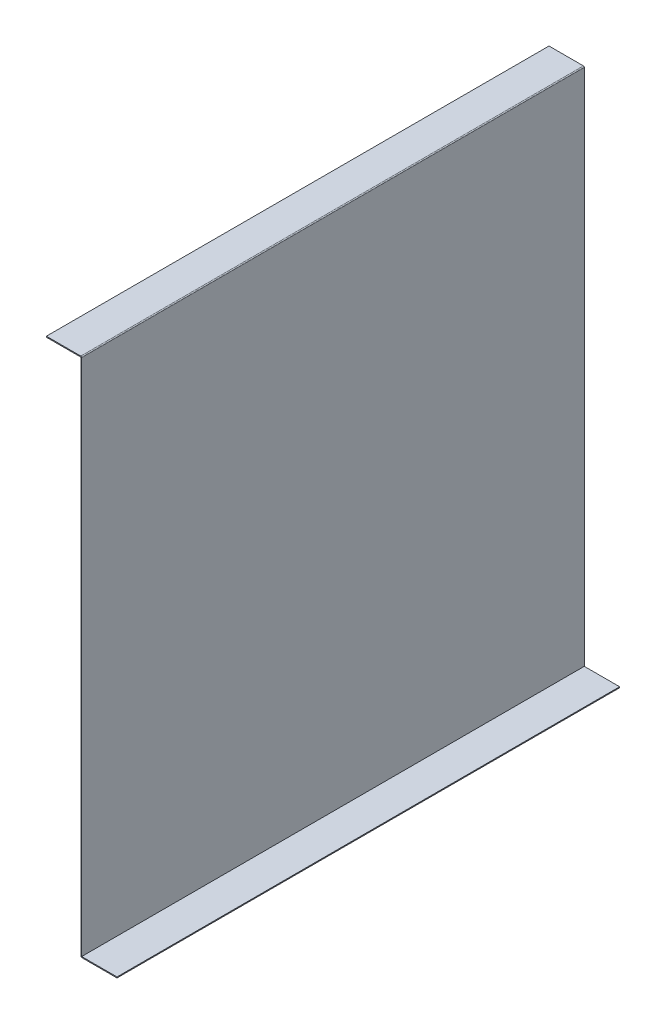
ISO-10303-21;
HEADER;
FILE_DESCRIPTION(('STEP AP214'),'2;1');
FILE_NAME('part.step','',(''),(''),'','','');
FILE_SCHEMA(('AUTOMOTIVE_DESIGN { 1 0 10303 214 1 1 1 1 }'));
ENDSEC;
DATA;
#1=APPLICATION_CONTEXT('core data for automotive mechanical design processes');
#2=APPLICATION_PROTOCOL_DEFINITION('international standard','automotive_design',2000,#1);
#3=PRODUCT_CONTEXT('',#1,'mechanical');
#4=PRODUCT('Part','Part','',(#3));
#5=PRODUCT_RELATED_PRODUCT_CATEGORY('part','',(#4));
#6=PRODUCT_DEFINITION_FORMATION('','',#4);
#7=PRODUCT_DEFINITION_CONTEXT('part definition',#1,'design');
#8=PRODUCT_DEFINITION('design','',#6,#7);
#9=PRODUCT_DEFINITION_SHAPE('','',#8);
#10=(LENGTH_UNIT() NAMED_UNIT(*) SI_UNIT(.MILLI.,.METRE.));
#11=(NAMED_UNIT(*) PLANE_ANGLE_UNIT() SI_UNIT($,.RADIAN.));
#12=(NAMED_UNIT(*) SI_UNIT($,.STERADIAN.) SOLID_ANGLE_UNIT());
#13=UNCERTAINTY_MEASURE_WITH_UNIT(LENGTH_MEASURE(1.E-05),#10,'distance_accuracy_value','');
#14=(GEOMETRIC_REPRESENTATION_CONTEXT(3) GLOBAL_UNCERTAINTY_ASSIGNED_CONTEXT((#13)) GLOBAL_UNIT_ASSIGNED_CONTEXT((#10,
#11,#12)) REPRESENTATION_CONTEXT('',''));
#15=CARTESIAN_POINT('',(0.,0.,0.));
#16=DIRECTION('',(0.,0.,1.));
#17=DIRECTION('',(1.,0.,0.));
#18=AXIS2_PLACEMENT_3D('',#15,#16,#17);
#19=CARTESIAN_POINT('',(-44.144869739479,440.61,213.5));
#20=DIRECTION('',(0.,0.,1.));
#21=DIRECTION('',(1.,0.,0.));
#22=AXIS2_PLACEMENT_3D('',#19,#20,#21);
#23=PLANE('',#22);
#24=DIRECTION('',(1.,0.,0.));
#25=VECTOR('',#24,1.);
#26=CARTESIAN_POINT('',(-44.144869739479,440.61,213.5));
#27=LINE('',#26,#25);
#28=CARTESIAN_POINT('',(-44.144869739479,440.61,213.5));
#29=VERTEX_POINT('',#28);
#30=CARTESIAN_POINT('',(-43.344869739479,440.61,213.5));
#31=VERTEX_POINT('',#30);
#32=EDGE_CURVE('E11',#29,#31,#27,.T.);
#33=ORIENTED_EDGE('',*,*,#32,.F.);
#34=DIRECTION('',(0.,1.,0.));
#35=VECTOR('',#34,1.);
#36=CARTESIAN_POINT('',(-44.144869739479,441.41,213.5));
#37=LINE('',#36,#35);
#38=CARTESIAN_POINT('',(-44.144869739479,0.,213.5));
#39=VERTEX_POINT('',#38);
#40=EDGE_CURVE('E159',#29,#39,#37,.F.);
#41=ORIENTED_EDGE('',*,*,#40,.T.);
#42=DIRECTION('',(-1.,0.,0.));
#43=VECTOR('',#42,1.);
#44=CARTESIAN_POINT('',(-43.344869739479,0.,213.5));
#45=LINE('',#44,#43);
#46=CARTESIAN_POINT('',(-43.344869739479,0.,213.5));
#47=VERTEX_POINT('',#46);
#48=EDGE_CURVE('E51',#47,#39,#45,.T.);
#49=ORIENTED_EDGE('',*,*,#48,.F.);
#50=DIRECTION('',(0.,-1.,0.));
#51=VECTOR('',#50,1.);
#52=CARTESIAN_POINT('',(-43.344869739479,441.41,213.5));
#53=LINE('',#52,#51);
#54=EDGE_CURVE('E142',#31,#47,#53,.T.);
#55=ORIENTED_EDGE('',*,*,#54,.F.);
#56=EDGE_LOOP('',(#33,#41,#49,#55));
#57=FACE_BOUND('',#56,.T.);
#58=ADVANCED_FACE('F37',(#57),#23,.T.);
#59=CARTESIAN_POINT('',(-44.144869739479,440.61,213.5));
#60=DIRECTION('',(0.,0.,1.));
#61=DIRECTION('',(1.,0.,0.));
#62=AXIS2_PLACEMENT_3D('',#59,#60,#61);
#63=PLANE('',#62);
#64=DIRECTION('',(0.,1.,0.));
#65=VECTOR('',#64,1.);
#66=CARTESIAN_POINT('',(-44.144869739479,440.61,213.5));
#67=LINE('',#66,#65);
#68=CARTESIAN_POINT('',(-44.144869739479,441.41,213.5));
#69=VERTEX_POINT('',#68);
#70=EDGE_CURVE('E44',#29,#69,#67,.T.);
#71=ORIENTED_EDGE('',*,*,#70,.F.);
#72=ORIENTED_EDGE('',*,*,#32,.T.);
#73=CARTESIAN_POINT('',(-44.144869739479,440.61,213.5));
#74=DIRECTION('',(0.,0.,1.));
#75=DIRECTION('',(1.,0.,0.));
#76=AXIS2_PLACEMENT_3D('',#73,#74,#75);
#77=CIRCLE('',#76,0.8);
#78=EDGE_CURVE('E147',#69,#31,#77,.F.);
#79=ORIENTED_EDGE('',*,*,#78,.F.);
#80=EDGE_LOOP('',(#71,#72,#79));
#81=FACE_BOUND('',#80,.T.);
#82=ADVANCED_FACE('F231',(#81),#63,.T.);
#83=CARTESIAN_POINT('',(-44.144869739479,440.61,-213.5));
#84=DIRECTION('',(0.,0.,-1.));
#85=DIRECTION('',(-1.,0.,0.));
#86=AXIS2_PLACEMENT_3D('',#83,#84,#85);
#87=PLANE('',#86);
#88=DIRECTION('',(0.,1.,0.));
#89=VECTOR('',#88,1.);
#90=CARTESIAN_POINT('',(-44.144869739479,440.61,-213.5));
#91=LINE('',#90,#89);
#92=CARTESIAN_POINT('',(-44.144869739479,440.61,-213.5));
#93=VERTEX_POINT('',#92);
#94=CARTESIAN_POINT('',(-44.144869739479,441.41,-213.5));
#95=VERTEX_POINT('',#94);
#96=EDGE_CURVE('E215',#93,#95,#91,.T.);
#97=ORIENTED_EDGE('',*,*,#96,.F.);
#98=DIRECTION('',(1.,0.,0.));
#99=VECTOR('',#98,1.);
#100=CARTESIAN_POINT('',(-73.344869739479,440.61,-213.5));
#101=LINE('',#100,#99);
#102=CARTESIAN_POINT('',(-73.344869739479,440.61,-213.5));
#103=VERTEX_POINT('',#102);
#104=EDGE_CURVE('E180',#103,#93,#101,.T.);
#105=ORIENTED_EDGE('',*,*,#104,.F.);
#106=DIRECTION('',(0.,1.,0.));
#107=VECTOR('',#106,1.);
#108=CARTESIAN_POINT('',(-73.344869739479,440.61,-213.5));
#109=LINE('',#108,#107);
#110=CARTESIAN_POINT('',(-73.344869739479,441.41,-213.5));
#111=VERTEX_POINT('',#110);
#112=EDGE_CURVE('E177',#103,#111,#109,.T.);
#113=ORIENTED_EDGE('',*,*,#112,.T.);
#114=DIRECTION('',(1.,0.,0.));
#115=VECTOR('',#114,1.);
#116=CARTESIAN_POINT('',(-73.344869739479,441.41,-213.5));
#117=LINE('',#116,#115);
#118=EDGE_CURVE('E174',#111,#95,#117,.T.);
#119=ORIENTED_EDGE('',*,*,#118,.T.);
#120=EDGE_LOOP('',(#97,#105,#113,#119));
#121=FACE_BOUND('',#120,.T.);
#122=ADVANCED_FACE('F262',(#121),#87,.T.);
#123=CARTESIAN_POINT('',(-44.144869739479,440.61,-213.5));
#124=DIRECTION('',(0.,0.,-1.));
#125=DIRECTION('',(-1.,0.,0.));
#126=AXIS2_PLACEMENT_3D('',#123,#124,#125);
#127=PLANE('',#126);
#128=DIRECTION('',(1.,0.,0.));
#129=VECTOR('',#128,1.);
#130=CARTESIAN_POINT('',(-44.144869739479,440.61,-213.5));
#131=LINE('',#130,#129);
#132=CARTESIAN_POINT('',(-43.344869739479,440.61,-213.5));
#133=VERTEX_POINT('',#132);
#134=EDGE_CURVE('E213',#93,#133,#131,.T.);
#135=ORIENTED_EDGE('',*,*,#134,.F.);
#136=ORIENTED_EDGE('',*,*,#96,.T.);
#137=CARTESIAN_POINT('',(-44.144869739479,440.61,-213.5));
#138=DIRECTION('',(0.,0.,1.));
#139=DIRECTION('',(1.,0.,0.));
#140=AXIS2_PLACEMENT_3D('',#137,#138,#139);
#141=CIRCLE('',#140,0.8);
#142=EDGE_CURVE('E171',#95,#133,#141,.F.);
#143=ORIENTED_EDGE('',*,*,#142,.T.);
#144=EDGE_LOOP('',(#135,#136,#143));
#145=FACE_BOUND('',#144,.T.);
#146=ADVANCED_FACE('F260',(#145),#127,.T.);
#147=CARTESIAN_POINT('',(-43.344869739479,0.,-213.5));
#148=DIRECTION('',(0.,0.,-1.));
#149=DIRECTION('',(-1.,0.,0.));
#150=AXIS2_PLACEMENT_3D('',#147,#148,#149);
#151=PLANE('',#150);
#152=DIRECTION('',(0.,-1.,0.));
#153=VECTOR('',#152,1.);
#154=CARTESIAN_POINT('',(-43.344869739479,0.,-213.5));
#155=LINE('',#154,#153);
#156=CARTESIAN_POINT('',(-43.344869739479,0.,-213.5));
#157=VERTEX_POINT('',#156);
#158=CARTESIAN_POINT('',(-43.344869739479,-0.8,-213.5));
#159=VERTEX_POINT('',#158);
#160=EDGE_CURVE('E211',#157,#159,#155,.T.);
#161=ORIENTED_EDGE('',*,*,#160,.F.);
#162=DIRECTION('',(1.,0.,0.));
#163=VECTOR('',#162,1.);
#164=CARTESIAN_POINT('',(-43.344869739479,0.,-213.5));
#165=LINE('',#164,#163);
#166=CARTESIAN_POINT('',(-13.3448697394789,0.,-213.5));
#167=VERTEX_POINT('',#166);
#168=EDGE_CURVE('E166',#157,#167,#165,.T.);
#169=ORIENTED_EDGE('',*,*,#168,.T.);
#170=DIRECTION('',(0.,-1.,0.));
#171=VECTOR('',#170,1.);
#172=CARTESIAN_POINT('',(-13.3448697394789,0.,-213.5));
#173=LINE('',#172,#171);
#174=CARTESIAN_POINT('',(-13.3448697394789,-0.8,-213.5));
#175=VERTEX_POINT('',#174);
#176=EDGE_CURVE('E164',#167,#175,#173,.T.);
#177=ORIENTED_EDGE('',*,*,#176,.T.);
#178=DIRECTION('',(1.,0.,0.));
#179=VECTOR('',#178,1.);
#180=CARTESIAN_POINT('',(-43.344869739479,-0.8,-213.5));
#181=LINE('',#180,#179);
#182=EDGE_CURVE('E132',#159,#175,#181,.T.);
#183=ORIENTED_EDGE('',*,*,#182,.F.);
#184=EDGE_LOOP('',(#161,#169,#177,#183));
#185=FACE_BOUND('',#184,.T.);
#186=ADVANCED_FACE('F269',(#185),#151,.T.);
#187=CARTESIAN_POINT('',(-43.344869739479,0.,-213.5));
#188=DIRECTION('',(0.,0.,-1.));
#189=DIRECTION('',(-1.,0.,0.));
#190=AXIS2_PLACEMENT_3D('',#187,#188,#189);
#191=PLANE('',#190);
#192=DIRECTION('',(-1.,0.,0.));
#193=VECTOR('',#192,1.);
#194=CARTESIAN_POINT('',(-43.344869739479,0.,-213.5));
#195=LINE('',#194,#193);
#196=CARTESIAN_POINT('',(-44.144869739479,0.,-213.5));
#197=VERTEX_POINT('',#196);
#198=EDGE_CURVE('E59',#157,#197,#195,.T.);
#199=ORIENTED_EDGE('',*,*,#198,.F.);
#200=ORIENTED_EDGE('',*,*,#160,.T.);
#201=CARTESIAN_POINT('',(-43.344869739479,0.,-213.5));
#202=DIRECTION('',(0.,0.,1.));
#203=DIRECTION('',(1.,0.,0.));
#204=AXIS2_PLACEMENT_3D('',#201,#202,#203);
#205=CIRCLE('',#204,0.8);
#206=EDGE_CURVE('E202',#159,#197,#205,.F.);
#207=ORIENTED_EDGE('',*,*,#206,.T.);
#208=EDGE_LOOP('',(#199,#200,#207));
#209=FACE_BOUND('',#208,.T.);
#210=ADVANCED_FACE('F300',(#209),#191,.T.);
#211=CARTESIAN_POINT('',(-43.344869739479,0.,213.5));
#212=DIRECTION('',(0.,0.,1.));
#213=DIRECTION('',(1.,0.,0.));
#214=AXIS2_PLACEMENT_3D('',#211,#212,#213);
#215=PLANE('',#214);
#216=DIRECTION('',(1.,0.,0.));
#217=VECTOR('',#216,1.);
#218=CARTESIAN_POINT('',(-73.344869739479,440.61,213.5));
#219=LINE('',#218,#217);
#220=CARTESIAN_POINT('',(-73.344869739479,440.61,213.5));
#221=VERTEX_POINT('',#220);
#222=EDGE_CURVE('E156',#221,#29,#219,.T.);
#223=ORIENTED_EDGE('',*,*,#222,.T.);
#224=ORIENTED_EDGE('',*,*,#70,.T.);
#225=DIRECTION('',(1.,0.,0.));
#226=VECTOR('',#225,1.);
#227=CARTESIAN_POINT('',(-73.344869739479,441.41,213.5));
#228=LINE('',#227,#226);
#229=CARTESIAN_POINT('',(-73.344869739479,441.41,213.5));
#230=VERTEX_POINT('',#229);
#231=EDGE_CURVE('E150',#230,#69,#228,.T.);
#232=ORIENTED_EDGE('',*,*,#231,.F.);
#233=DIRECTION('',(0.,1.,0.));
#234=VECTOR('',#233,1.);
#235=CARTESIAN_POINT('',(-73.344869739479,440.61,213.5));
#236=LINE('',#235,#234);
#237=EDGE_CURVE('E153',#221,#230,#236,.T.);
#238=ORIENTED_EDGE('',*,*,#237,.F.);
#239=EDGE_LOOP('',(#223,#224,#232,#238));
#240=FACE_BOUND('',#239,.T.);
#241=ADVANCED_FACE('F220',(#240),#215,.T.);
#242=CARTESIAN_POINT('',(-43.344869739479,0.,213.5));
#243=DIRECTION('',(0.,0.,1.));
#244=DIRECTION('',(1.,0.,0.));
#245=AXIS2_PLACEMENT_3D('',#242,#243,#244);
#246=PLANE('',#245);
#247=DIRECTION('',(0.,-1.,0.));
#248=VECTOR('',#247,1.);
#249=CARTESIAN_POINT('',(-43.344869739479,0.,213.5));
#250=LINE('',#249,#248);
#251=CARTESIAN_POINT('',(-43.344869739479,-0.8,213.5));
#252=VERTEX_POINT('',#251);
#253=EDGE_CURVE('E122',#47,#252,#250,.T.);
#254=ORIENTED_EDGE('',*,*,#253,.F.);
#255=ORIENTED_EDGE('',*,*,#48,.T.);
#256=CARTESIAN_POINT('',(-43.344869739479,0.,213.5));
#257=DIRECTION('',(0.,0.,1.));
#258=DIRECTION('',(1.,0.,0.));
#259=AXIS2_PLACEMENT_3D('',#256,#257,#258);
#260=CIRCLE('',#259,0.8);
#261=EDGE_CURVE('E206',#39,#252,#260,.T.);
#262=ORIENTED_EDGE('',*,*,#261,.T.);
#263=EDGE_LOOP('',(#254,#255,#262));
#264=FACE_BOUND('',#263,.T.);
#265=ADVANCED_FACE('F250',(#264),#246,.T.);
#266=CARTESIAN_POINT('',(-43.344869739479,-0.8,213.5));
#267=DIRECTION('',(0.,1.,0.));
#268=DIRECTION('',(0.,0.,1.));
#269=AXIS2_PLACEMENT_3D('',#266,#267,#268);
#270=PLANE('',#269);
#271=DIRECTION('',(1.,0.,0.));
#272=VECTOR('',#271,1.);
#273=CARTESIAN_POINT('',(-43.344869739479,-0.8,213.5));
#274=LINE('',#273,#272);
#275=CARTESIAN_POINT('',(-13.3448697394789,-0.8,213.5));
#276=VERTEX_POINT('',#275);
#277=EDGE_CURVE('E115',#252,#276,#274,.T.);
#278=ORIENTED_EDGE('',*,*,#277,.F.);
#279=DIRECTION('',(0.,0.,-1.));
#280=VECTOR('',#279,1.);
#281=CARTESIAN_POINT('',(-43.344869739479,-0.8,213.5));
#282=LINE('',#281,#280);
#283=EDGE_CURVE('E136',#252,#159,#282,.T.);
#284=ORIENTED_EDGE('',*,*,#283,.T.);
#285=ORIENTED_EDGE('',*,*,#182,.T.);
#286=DIRECTION('',(0.,0.,-1.));
#287=VECTOR('',#286,1.);
#288=CARTESIAN_POINT('',(-13.3448697394789,-0.8,213.5));
#289=LINE('',#288,#287);
#290=EDGE_CURVE('E129',#276,#175,#289,.T.);
#291=ORIENTED_EDGE('',*,*,#290,.F.);
#292=EDGE_LOOP('',(#278,#284,#285,#291));
#293=FACE_BOUND('',#292,.T.);
#294=ADVANCED_FACE('F130',(#293),#270,.F.);
#295=CARTESIAN_POINT('',(-13.3448697394789,0.,213.5));
#296=DIRECTION('',(1.,0.,0.));
#297=DIRECTION('',(0.,0.,-1.));
#298=AXIS2_PLACEMENT_3D('',#295,#296,#297);
#299=PLANE('',#298);
#300=ORIENTED_EDGE('',*,*,#176,.F.);
#301=DIRECTION('',(0.,0.,-1.));
#302=VECTOR('',#301,1.);
#303=CARTESIAN_POINT('',(-13.3448697394789,0.,213.5));
#304=LINE('',#303,#302);
#305=CARTESIAN_POINT('',(-13.3448697394789,0.,213.5));
#306=VERTEX_POINT('',#305);
#307=EDGE_CURVE('E137',#306,#167,#304,.T.);
#308=ORIENTED_EDGE('',*,*,#307,.F.);
#309=DIRECTION('',(0.,-1.,0.));
#310=VECTOR('',#309,1.);
#311=CARTESIAN_POINT('',(-13.3448697394789,0.,213.5));
#312=LINE('',#311,#310);
#313=EDGE_CURVE('E120',#306,#276,#312,.T.);
#314=ORIENTED_EDGE('',*,*,#313,.T.);
#315=ORIENTED_EDGE('',*,*,#290,.T.);
#316=EDGE_LOOP('',(#300,#308,#314,#315));
#317=FACE_BOUND('',#316,.T.);
#318=ADVANCED_FACE('F139',(#317),#299,.T.);
#319=CARTESIAN_POINT('',(-43.344869739479,0.,213.5));
#320=DIRECTION('',(0.,1.,0.));
#321=DIRECTION('',(0.,0.,1.));
#322=AXIS2_PLACEMENT_3D('',#319,#320,#321);
#323=PLANE('',#322);
#324=ORIENTED_EDGE('',*,*,#168,.F.);
#325=DIRECTION('',(0.,0.,-1.));
#326=VECTOR('',#325,1.);
#327=CARTESIAN_POINT('',(-43.344869739479,0.,213.5));
#328=LINE('',#327,#326);
#329=EDGE_CURVE('E197',#47,#157,#328,.T.);
#330=ORIENTED_EDGE('',*,*,#329,.F.);
#331=DIRECTION('',(1.,0.,0.));
#332=VECTOR('',#331,1.);
#333=CARTESIAN_POINT('',(-43.344869739479,0.,213.5));
#334=LINE('',#333,#332);
#335=EDGE_CURVE('E140',#47,#306,#334,.T.);
#336=ORIENTED_EDGE('',*,*,#335,.T.);
#337=ORIENTED_EDGE('',*,*,#307,.T.);
#338=EDGE_LOOP('',(#324,#330,#336,#337));
#339=FACE_BOUND('',#338,.T.);
#340=ADVANCED_FACE('F254',(#339),#323,.T.);
#341=CARTESIAN_POINT('',(-43.344869739479,441.41,213.5));
#342=DIRECTION('',(1.,0.,0.));
#343=DIRECTION('',(0.,0.,-1.));
#344=AXIS2_PLACEMENT_3D('',#341,#342,#343);
#345=PLANE('',#344);
#346=DIRECTION('',(0.,-1.,0.));
#347=VECTOR('',#346,1.);
#348=CARTESIAN_POINT('',(-43.344869739479,441.41,-213.5));
#349=LINE('',#348,#347);
#350=EDGE_CURVE('E169',#133,#157,#349,.T.);
#351=ORIENTED_EDGE('',*,*,#350,.F.);
#352=DIRECTION('',(0.,0.,-1.));
#353=VECTOR('',#352,1.);
#354=CARTESIAN_POINT('',(-43.344869739479,440.61,213.5));
#355=LINE('',#354,#353);
#356=EDGE_CURVE('E194',#31,#133,#355,.T.);
#357=ORIENTED_EDGE('',*,*,#356,.F.);
#358=ORIENTED_EDGE('',*,*,#54,.T.);
#359=ORIENTED_EDGE('',*,*,#329,.T.);
#360=EDGE_LOOP('',(#351,#357,#358,#359));
#361=FACE_BOUND('',#360,.T.);
#362=ADVANCED_FACE('F257',(#361),#345,.T.);
#363=CARTESIAN_POINT('',(-44.144869739479,440.61,213.5));
#364=DIRECTION('',(0.,0.,-1.));
#365=DIRECTION('',(-1.,0.,0.));
#366=AXIS2_PLACEMENT_3D('',#363,#364,#365);
#367=CYLINDRICAL_SURFACE('',#366,0.8);
#368=ORIENTED_EDGE('',*,*,#142,.F.);
#369=DIRECTION('',(0.,0.,-1.));
#370=VECTOR('',#369,1.);
#371=CARTESIAN_POINT('',(-44.144869739479,441.41,213.5));
#372=LINE('',#371,#370);
#373=EDGE_CURVE('E191',#69,#95,#372,.T.);
#374=ORIENTED_EDGE('',*,*,#373,.F.);
#375=ORIENTED_EDGE('',*,*,#78,.T.);
#376=ORIENTED_EDGE('',*,*,#356,.T.);
#377=EDGE_LOOP('',(#368,#374,#375,#376));
#378=FACE_BOUND('',#377,.T.);
#379=ADVANCED_FACE('F228',(#378),#367,.T.);
#380=CARTESIAN_POINT('',(-73.344869739479,441.41,213.5));
#381=DIRECTION('',(0.,1.,0.));
#382=DIRECTION('',(0.,0.,1.));
#383=AXIS2_PLACEMENT_3D('',#380,#381,#382);
#384=PLANE('',#383);
#385=ORIENTED_EDGE('',*,*,#118,.F.);
#386=DIRECTION('',(0.,0.,-1.));
#387=VECTOR('',#386,1.);
#388=CARTESIAN_POINT('',(-73.344869739479,441.41,213.5));
#389=LINE('',#388,#387);
#390=EDGE_CURVE('E189',#230,#111,#389,.T.);
#391=ORIENTED_EDGE('',*,*,#390,.F.);
#392=ORIENTED_EDGE('',*,*,#231,.T.);
#393=ORIENTED_EDGE('',*,*,#373,.T.);
#394=EDGE_LOOP('',(#385,#391,#392,#393));
#395=FACE_BOUND('',#394,.T.);
#396=ADVANCED_FACE('F233',(#395),#384,.T.);
#397=CARTESIAN_POINT('',(-73.344869739479,440.61,213.5));
#398=DIRECTION('',(-1.,0.,0.));
#399=DIRECTION('',(0.,0.,1.));
#400=AXIS2_PLACEMENT_3D('',#397,#398,#399);
#401=PLANE('',#400);
#402=ORIENTED_EDGE('',*,*,#112,.F.);
#403=DIRECTION('',(0.,0.,-1.));
#404=VECTOR('',#403,1.);
#405=CARTESIAN_POINT('',(-73.344869739479,440.61,213.5));
#406=LINE('',#405,#404);
#407=EDGE_CURVE('E187',#221,#103,#406,.T.);
#408=ORIENTED_EDGE('',*,*,#407,.F.);
#409=ORIENTED_EDGE('',*,*,#237,.T.);
#410=ORIENTED_EDGE('',*,*,#390,.T.);
#411=EDGE_LOOP('',(#402,#408,#409,#410));
#412=FACE_BOUND('',#411,.T.);
#413=ADVANCED_FACE('F236',(#412),#401,.T.);
#414=CARTESIAN_POINT('',(-73.344869739479,440.61,213.5));
#415=DIRECTION('',(0.,1.,0.));
#416=DIRECTION('',(0.,0.,1.));
#417=AXIS2_PLACEMENT_3D('',#414,#415,#416);
#418=PLANE('',#417);
#419=ORIENTED_EDGE('',*,*,#104,.T.);
#420=DIRECTION('',(0.,0.,-1.));
#421=VECTOR('',#420,1.);
#422=CARTESIAN_POINT('',(-44.144869739479,440.61,213.5));
#423=LINE('',#422,#421);
#424=EDGE_CURVE('E162',#29,#93,#423,.T.);
#425=ORIENTED_EDGE('',*,*,#424,.F.);
#426=ORIENTED_EDGE('',*,*,#222,.F.);
#427=ORIENTED_EDGE('',*,*,#407,.T.);
#428=EDGE_LOOP('',(#419,#425,#426,#427));
#429=FACE_BOUND('',#428,.T.);
#430=ADVANCED_FACE('F239',(#429),#418,.F.);
#431=CARTESIAN_POINT('',(-44.144869739479,441.41,213.5));
#432=DIRECTION('',(1.,0.,0.));
#433=DIRECTION('',(0.,0.,-1.));
#434=AXIS2_PLACEMENT_3D('',#431,#432,#433);
#435=PLANE('',#434);
#436=DIRECTION('',(0.,1.,0.));
#437=VECTOR('',#436,1.);
#438=CARTESIAN_POINT('',(-44.144869739479,441.41,-213.5));
#439=LINE('',#438,#437);
#440=EDGE_CURVE('E126',#93,#197,#439,.F.);
#441=ORIENTED_EDGE('',*,*,#440,.T.);
#442=DIRECTION('',(0.,0.,-1.));
#443=VECTOR('',#442,1.);
#444=CARTESIAN_POINT('',(-44.144869739479,0.,213.5));
#445=LINE('',#444,#443);
#446=EDGE_CURVE('E204',#197,#39,#445,.F.);
#447=ORIENTED_EDGE('',*,*,#446,.T.);
#448=ORIENTED_EDGE('',*,*,#40,.F.);
#449=ORIENTED_EDGE('',*,*,#424,.T.);
#450=EDGE_LOOP('',(#441,#447,#448,#449));
#451=FACE_BOUND('',#450,.T.);
#452=ADVANCED_FACE('F242',(#451),#435,.F.);
#453=CARTESIAN_POINT('',(-44.144869739479,440.61,213.5));
#454=DIRECTION('',(0.,0.,1.));
#455=DIRECTION('',(1.,0.,0.));
#456=AXIS2_PLACEMENT_3D('',#453,#454,#455);
#457=PLANE('',#456);
#458=ORIENTED_EDGE('',*,*,#335,.F.);
#459=ORIENTED_EDGE('',*,*,#253,.T.);
#460=ORIENTED_EDGE('',*,*,#277,.T.);
#461=ORIENTED_EDGE('',*,*,#313,.F.);
#462=EDGE_LOOP('',(#458,#459,#460,#461));
#463=FACE_BOUND('',#462,.T.);
#464=ADVANCED_FACE('F118',(#463),#457,.T.);
#465=CARTESIAN_POINT('',(-44.144869739479,440.61,-213.5));
#466=DIRECTION('',(0.,0.,1.));
#467=DIRECTION('',(1.,0.,0.));
#468=AXIS2_PLACEMENT_3D('',#465,#466,#467);
#469=PLANE('',#468);
#470=ORIENTED_EDGE('',*,*,#350,.T.);
#471=ORIENTED_EDGE('',*,*,#198,.T.);
#472=ORIENTED_EDGE('',*,*,#440,.F.);
#473=ORIENTED_EDGE('',*,*,#134,.T.);
#474=EDGE_LOOP('',(#470,#471,#472,#473));
#475=FACE_BOUND('',#474,.T.);
#476=ADVANCED_FACE('F420',(#475),#469,.F.);
#477=CARTESIAN_POINT('',(-43.344869739479,0.,213.5));
#478=DIRECTION('',(0.,0.,-1.));
#479=DIRECTION('',(-1.,0.,0.));
#480=AXIS2_PLACEMENT_3D('',#477,#478,#479);
#481=CYLINDRICAL_SURFACE('',#480,0.8);
#482=ORIENTED_EDGE('',*,*,#261,.F.);
#483=ORIENTED_EDGE('',*,*,#446,.F.);
#484=ORIENTED_EDGE('',*,*,#206,.F.);
#485=ORIENTED_EDGE('',*,*,#283,.F.);
#486=EDGE_LOOP('',(#482,#483,#484,#485));
#487=FACE_BOUND('',#486,.T.);
#488=ADVANCED_FACE('F248',(#487),#481,.T.);
#489=CLOSED_SHELL('',(#58,#82,#122,#146,#186,#210,#241,#265,#294,#318,#340,#362,#379,#396,#413,
#430,#452,#464,#476,#488));
#490=MANIFOLD_SOLID_BREP('B2',#489);
#491=ADVANCED_BREP_SHAPE_REPRESENTATION('',(#18,#490),#14);
#492=SHAPE_DEFINITION_REPRESENTATION(#9,#491);
ENDSEC;
END-ISO-10303-21;
